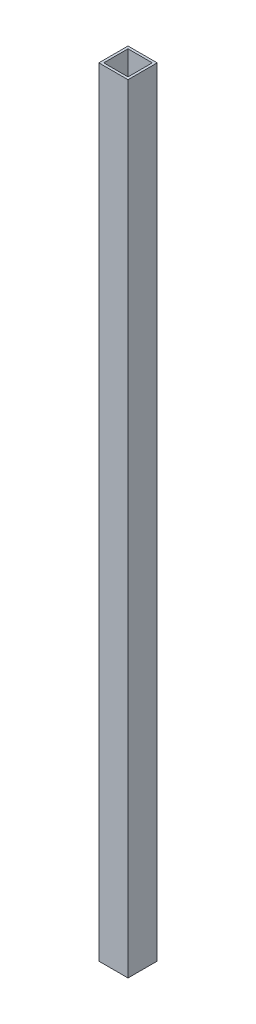
ISO-10303-21;
HEADER;
FILE_DESCRIPTION(('STEP AP214'),'2;1');
FILE_NAME('part.step','',(''),(''),'','','');
FILE_SCHEMA(('AUTOMOTIVE_DESIGN { 1 0 10303 214 1 1 1 1 }'));
ENDSEC;
DATA;
#1=APPLICATION_CONTEXT('core data for automotive mechanical design processes');
#2=APPLICATION_PROTOCOL_DEFINITION('international standard','automotive_design',2000,#1);
#3=PRODUCT_CONTEXT('',#1,'mechanical');
#4=PRODUCT('Part','Part','',(#3));
#5=PRODUCT_RELATED_PRODUCT_CATEGORY('part','',(#4));
#6=PRODUCT_DEFINITION_FORMATION('','',#4);
#7=PRODUCT_DEFINITION_CONTEXT('part definition',#1,'design');
#8=PRODUCT_DEFINITION('design','',#6,#7);
#9=PRODUCT_DEFINITION_SHAPE('','',#8);
#10=(LENGTH_UNIT() NAMED_UNIT(*) SI_UNIT(.MILLI.,.METRE.));
#11=(NAMED_UNIT(*) PLANE_ANGLE_UNIT() SI_UNIT($,.RADIAN.));
#12=(NAMED_UNIT(*) SI_UNIT($,.STERADIAN.) SOLID_ANGLE_UNIT());
#13=UNCERTAINTY_MEASURE_WITH_UNIT(LENGTH_MEASURE(1.E-05),#10,'distance_accuracy_value','');
#14=(GEOMETRIC_REPRESENTATION_CONTEXT(3) GLOBAL_UNCERTAINTY_ASSIGNED_CONTEXT((#13)) GLOBAL_UNIT_ASSIGNED_CONTEXT((#10,
#11,#12)) REPRESENTATION_CONTEXT('',''));
#15=CARTESIAN_POINT('',(0.,0.,0.));
#16=DIRECTION('',(0.,0.,1.));
#17=DIRECTION('',(1.,0.,0.));
#18=AXIS2_PLACEMENT_3D('',#15,#16,#17);
#19=CARTESIAN_POINT('',(0.,508.,0.));
#20=DIRECTION('',(0.,1.,0.));
#21=DIRECTION('',(0.,0.,1.));
#22=AXIS2_PLACEMENT_3D('',#19,#20,#21);
#23=PLANE('',#22);
#24=DIRECTION('',(0.,0.,1.));
#25=VECTOR('',#24,1.);
#26=CARTESIAN_POINT('',(0.,508.,0.));
#27=LINE('',#26,#25);
#28=CARTESIAN_POINT('',(0.,508.,-19.05));
#29=VERTEX_POINT('',#28);
#30=CARTESIAN_POINT('',(0.,508.,0.));
#31=VERTEX_POINT('',#30);
#32=EDGE_CURVE('E158',#29,#31,#27,.T.);
#33=ORIENTED_EDGE('',*,*,#32,.T.);
#34=DIRECTION('',(1.,0.,0.));
#35=VECTOR('',#34,1.);
#36=CARTESIAN_POINT('',(0.,508.,0.));
#37=LINE('',#36,#35);
#38=CARTESIAN_POINT('',(19.05,508.,0.));
#39=VERTEX_POINT('',#38);
#40=EDGE_CURVE('E161',#31,#39,#37,.T.);
#41=ORIENTED_EDGE('',*,*,#40,.T.);
#42=DIRECTION('',(0.,0.,-1.));
#43=VECTOR('',#42,1.);
#44=CARTESIAN_POINT('',(19.05,508.,0.));
#45=LINE('',#44,#43);
#46=CARTESIAN_POINT('',(19.05,508.,-19.05));
#47=VERTEX_POINT('',#46);
#48=EDGE_CURVE('E164',#39,#47,#45,.T.);
#49=ORIENTED_EDGE('',*,*,#48,.T.);
#50=DIRECTION('',(-1.,0.,0.));
#51=VECTOR('',#50,1.);
#52=CARTESIAN_POINT('',(0.,508.,-19.05));
#53=LINE('',#52,#51);
#54=EDGE_CURVE('E166',#47,#29,#53,.T.);
#55=ORIENTED_EDGE('',*,*,#54,.T.);
#56=EDGE_LOOP('',(#33,#41,#49,#55));
#57=FACE_BOUND('',#56,.T.);
#58=DIRECTION('',(1.,0.,0.));
#59=VECTOR('',#58,1.);
#60=CARTESIAN_POINT('',(0.,508.,-1.5875));
#61=LINE('',#60,#59);
#62=CARTESIAN_POINT('',(1.5875,508.,-1.5875));
#63=VERTEX_POINT('',#62);
#64=CARTESIAN_POINT('',(17.4625,508.,-1.5875));
#65=VERTEX_POINT('',#64);
#66=EDGE_CURVE('E130',#63,#65,#61,.T.);
#67=ORIENTED_EDGE('',*,*,#66,.F.);
#68=DIRECTION('',(0.,0.,1.));
#69=VECTOR('',#68,1.);
#70=CARTESIAN_POINT('',(1.5875,508.,0.));
#71=LINE('',#70,#69);
#72=CARTESIAN_POINT('',(1.5875,508.,-17.4625));
#73=VERTEX_POINT('',#72);
#74=EDGE_CURVE('E122',#73,#63,#71,.T.);
#75=ORIENTED_EDGE('',*,*,#74,.F.);
#76=DIRECTION('',(-1.,0.,0.));
#77=VECTOR('',#76,1.);
#78=CARTESIAN_POINT('',(0.,508.,-17.4625));
#79=LINE('',#78,#77);
#80=CARTESIAN_POINT('',(17.4625,508.,-17.4625));
#81=VERTEX_POINT('',#80);
#82=EDGE_CURVE('E144',#81,#73,#79,.T.);
#83=ORIENTED_EDGE('',*,*,#82,.F.);
#84=DIRECTION('',(0.,0.,-1.));
#85=VECTOR('',#84,1.);
#86=CARTESIAN_POINT('',(17.4625,508.,0.));
#87=LINE('',#86,#85);
#88=EDGE_CURVE('E142',#65,#81,#87,.T.);
#89=ORIENTED_EDGE('',*,*,#88,.F.);
#90=EDGE_LOOP('',(#67,#75,#83,#89));
#91=FACE_BOUND('',#90,.T.);
#92=ADVANCED_FACE('F57',(#57,#91),#23,.T.);
#93=CARTESIAN_POINT('',(0.,0.,0.));
#94=DIRECTION('',(0.,1.,0.));
#95=DIRECTION('',(0.,0.,1.));
#96=AXIS2_PLACEMENT_3D('',#93,#94,#95);
#97=PLANE('',#96);
#98=DIRECTION('',(0.,0.,1.));
#99=VECTOR('',#98,1.);
#100=CARTESIAN_POINT('',(0.,0.,0.));
#101=LINE('',#100,#99);
#102=CARTESIAN_POINT('',(0.,0.,-19.05));
#103=VERTEX_POINT('',#102);
#104=CARTESIAN_POINT('',(0.,0.,0.));
#105=VERTEX_POINT('',#104);
#106=EDGE_CURVE('E138',#103,#105,#101,.T.);
#107=ORIENTED_EDGE('',*,*,#106,.F.);
#108=DIRECTION('',(-1.,0.,0.));
#109=VECTOR('',#108,1.);
#110=CARTESIAN_POINT('',(0.,0.,-19.05));
#111=LINE('',#110,#109);
#112=CARTESIAN_POINT('',(19.05,0.,-19.05));
#113=VERTEX_POINT('',#112);
#114=EDGE_CURVE('E162',#113,#103,#111,.T.);
#115=ORIENTED_EDGE('',*,*,#114,.F.);
#116=DIRECTION('',(0.,0.,-1.));
#117=VECTOR('',#116,1.);
#118=CARTESIAN_POINT('',(19.05,0.,0.));
#119=LINE('',#118,#117);
#120=CARTESIAN_POINT('',(19.05,0.,0.));
#121=VERTEX_POINT('',#120);
#122=EDGE_CURVE('E173',#121,#113,#119,.T.);
#123=ORIENTED_EDGE('',*,*,#122,.F.);
#124=DIRECTION('',(1.,0.,0.));
#125=VECTOR('',#124,1.);
#126=CARTESIAN_POINT('',(0.,0.,0.));
#127=LINE('',#126,#125);
#128=EDGE_CURVE('E171',#105,#121,#127,.T.);
#129=ORIENTED_EDGE('',*,*,#128,.F.);
#130=EDGE_LOOP('',(#107,#115,#123,#129));
#131=FACE_BOUND('',#130,.T.);
#132=DIRECTION('',(0.,0.,1.));
#133=VECTOR('',#132,1.);
#134=CARTESIAN_POINT('',(1.5875,0.,0.));
#135=LINE('',#134,#133);
#136=CARTESIAN_POINT('',(1.5875,0.,-17.4625));
#137=VERTEX_POINT('',#136);
#138=CARTESIAN_POINT('',(1.5875,0.,-1.5875));
#139=VERTEX_POINT('',#138);
#140=EDGE_CURVE('E80',#137,#139,#135,.T.);
#141=ORIENTED_EDGE('',*,*,#140,.T.);
#142=DIRECTION('',(1.,0.,0.));
#143=VECTOR('',#142,1.);
#144=CARTESIAN_POINT('',(0.,0.,-1.5875));
#145=LINE('',#144,#143);
#146=CARTESIAN_POINT('',(17.4625,0.,-1.5875));
#147=VERTEX_POINT('',#146);
#148=EDGE_CURVE('E137',#139,#147,#145,.T.);
#149=ORIENTED_EDGE('',*,*,#148,.T.);
#150=DIRECTION('',(0.,0.,-1.));
#151=VECTOR('',#150,1.);
#152=CARTESIAN_POINT('',(17.4625,0.,0.));
#153=LINE('',#152,#151);
#154=CARTESIAN_POINT('',(17.4625,0.,-17.4625));
#155=VERTEX_POINT('',#154);
#156=EDGE_CURVE('E150',#147,#155,#153,.T.);
#157=ORIENTED_EDGE('',*,*,#156,.T.);
#158=DIRECTION('',(-1.,0.,0.));
#159=VECTOR('',#158,1.);
#160=CARTESIAN_POINT('',(0.,0.,-17.4625));
#161=LINE('',#160,#159);
#162=EDGE_CURVE('E131',#155,#137,#161,.T.);
#163=ORIENTED_EDGE('',*,*,#162,.T.);
#164=EDGE_LOOP('',(#141,#149,#157,#163));
#165=FACE_BOUND('',#164,.T.);
#166=ADVANCED_FACE('F191',(#131,#165),#97,.F.);
#167=CARTESIAN_POINT('',(0.,508.,0.));
#168=DIRECTION('',(1.,0.,0.));
#169=DIRECTION('',(0.,0.,-1.));
#170=AXIS2_PLACEMENT_3D('',#167,#168,#169);
#171=PLANE('',#170);
#172=ORIENTED_EDGE('',*,*,#106,.T.);
#173=DIRECTION('',(0.,-1.,0.));
#174=VECTOR('',#173,1.);
#175=CARTESIAN_POINT('',(0.,508.,0.));
#176=LINE('',#175,#174);
#177=EDGE_CURVE('E12',#31,#105,#176,.T.);
#178=ORIENTED_EDGE('',*,*,#177,.F.);
#179=ORIENTED_EDGE('',*,*,#32,.F.);
#180=DIRECTION('',(0.,-1.,0.));
#181=VECTOR('',#180,1.);
#182=CARTESIAN_POINT('',(0.,508.,-19.05));
#183=LINE('',#182,#181);
#184=EDGE_CURVE('E168',#29,#103,#183,.T.);
#185=ORIENTED_EDGE('',*,*,#184,.T.);
#186=EDGE_LOOP('',(#172,#178,#179,#185));
#187=FACE_BOUND('',#186,.T.);
#188=ADVANCED_FACE('F59',(#187),#171,.F.);
#189=CARTESIAN_POINT('',(0.,508.,0.));
#190=DIRECTION('',(0.,0.,-1.));
#191=DIRECTION('',(-1.,0.,0.));
#192=AXIS2_PLACEMENT_3D('',#189,#190,#191);
#193=PLANE('',#192);
#194=ORIENTED_EDGE('',*,*,#128,.T.);
#195=DIRECTION('',(0.,-1.,0.));
#196=VECTOR('',#195,1.);
#197=CARTESIAN_POINT('',(19.05,508.,0.));
#198=LINE('',#197,#196);
#199=EDGE_CURVE('E65',#39,#121,#198,.T.);
#200=ORIENTED_EDGE('',*,*,#199,.F.);
#201=ORIENTED_EDGE('',*,*,#40,.F.);
#202=ORIENTED_EDGE('',*,*,#177,.T.);
#203=EDGE_LOOP('',(#194,#200,#201,#202));
#204=FACE_BOUND('',#203,.T.);
#205=ADVANCED_FACE('F201',(#204),#193,.F.);
#206=CARTESIAN_POINT('',(19.05,508.,0.));
#207=DIRECTION('',(-1.,0.,0.));
#208=DIRECTION('',(0.,0.,1.));
#209=AXIS2_PLACEMENT_3D('',#206,#207,#208);
#210=PLANE('',#209);
#211=ORIENTED_EDGE('',*,*,#122,.T.);
#212=DIRECTION('',(0.,-1.,0.));
#213=VECTOR('',#212,1.);
#214=CARTESIAN_POINT('',(19.05,508.,-19.05));
#215=LINE('',#214,#213);
#216=EDGE_CURVE('E178',#47,#113,#215,.T.);
#217=ORIENTED_EDGE('',*,*,#216,.F.);
#218=ORIENTED_EDGE('',*,*,#48,.F.);
#219=ORIENTED_EDGE('',*,*,#199,.T.);
#220=EDGE_LOOP('',(#211,#217,#218,#219));
#221=FACE_BOUND('',#220,.T.);
#222=ADVANCED_FACE('F185',(#221),#210,.F.);
#223=CARTESIAN_POINT('',(0.,508.,-19.05));
#224=DIRECTION('',(0.,0.,1.));
#225=DIRECTION('',(1.,0.,0.));
#226=AXIS2_PLACEMENT_3D('',#223,#224,#225);
#227=PLANE('',#226);
#228=ORIENTED_EDGE('',*,*,#114,.T.);
#229=ORIENTED_EDGE('',*,*,#184,.F.);
#230=ORIENTED_EDGE('',*,*,#54,.F.);
#231=ORIENTED_EDGE('',*,*,#216,.T.);
#232=EDGE_LOOP('',(#228,#229,#230,#231));
#233=FACE_BOUND('',#232,.T.);
#234=ADVANCED_FACE('F195',(#233),#227,.F.);
#235=CARTESIAN_POINT('',(1.5875,508.,0.));
#236=DIRECTION('',(1.,0.,0.));
#237=DIRECTION('',(0.,0.,-1.));
#238=AXIS2_PLACEMENT_3D('',#235,#236,#237);
#239=PLANE('',#238);
#240=ORIENTED_EDGE('',*,*,#140,.F.);
#241=DIRECTION('',(0.,-1.,0.));
#242=VECTOR('',#241,1.);
#243=CARTESIAN_POINT('',(1.5875,508.,-17.4625));
#244=LINE('',#243,#242);
#245=EDGE_CURVE('E126',#73,#137,#244,.T.);
#246=ORIENTED_EDGE('',*,*,#245,.F.);
#247=ORIENTED_EDGE('',*,*,#74,.T.);
#248=DIRECTION('',(0.,-1.,0.));
#249=VECTOR('',#248,1.);
#250=CARTESIAN_POINT('',(1.5875,508.,-1.5875));
#251=LINE('',#250,#249);
#252=EDGE_CURVE('E125',#63,#139,#251,.T.);
#253=ORIENTED_EDGE('',*,*,#252,.T.);
#254=EDGE_LOOP('',(#240,#246,#247,#253));
#255=FACE_BOUND('',#254,.T.);
#256=ADVANCED_FACE('F124',(#255),#239,.T.);
#257=CARTESIAN_POINT('',(0.,508.,-1.5875));
#258=DIRECTION('',(0.,0.,-1.));
#259=DIRECTION('',(-1.,0.,0.));
#260=AXIS2_PLACEMENT_3D('',#257,#258,#259);
#261=PLANE('',#260);
#262=ORIENTED_EDGE('',*,*,#148,.F.);
#263=ORIENTED_EDGE('',*,*,#252,.F.);
#264=ORIENTED_EDGE('',*,*,#66,.T.);
#265=DIRECTION('',(0.,-1.,0.));
#266=VECTOR('',#265,1.);
#267=CARTESIAN_POINT('',(17.4625,508.,-1.5875));
#268=LINE('',#267,#266);
#269=EDGE_CURVE('E139',#65,#147,#268,.T.);
#270=ORIENTED_EDGE('',*,*,#269,.T.);
#271=EDGE_LOOP('',(#262,#263,#264,#270));
#272=FACE_BOUND('',#271,.T.);
#273=ADVANCED_FACE('F134',(#272),#261,.T.);
#274=CARTESIAN_POINT('',(17.4625,508.,0.));
#275=DIRECTION('',(-1.,0.,0.));
#276=DIRECTION('',(0.,0.,1.));
#277=AXIS2_PLACEMENT_3D('',#274,#275,#276);
#278=PLANE('',#277);
#279=ORIENTED_EDGE('',*,*,#156,.F.);
#280=ORIENTED_EDGE('',*,*,#269,.F.);
#281=ORIENTED_EDGE('',*,*,#88,.T.);
#282=DIRECTION('',(0.,-1.,0.));
#283=VECTOR('',#282,1.);
#284=CARTESIAN_POINT('',(17.4625,508.,-17.4625));
#285=LINE('',#284,#283);
#286=EDGE_CURVE('E72',#81,#155,#285,.T.);
#287=ORIENTED_EDGE('',*,*,#286,.T.);
#288=EDGE_LOOP('',(#279,#280,#281,#287));
#289=FACE_BOUND('',#288,.T.);
#290=ADVANCED_FACE('F224',(#289),#278,.T.);
#291=CARTESIAN_POINT('',(0.,508.,-17.4625));
#292=DIRECTION('',(0.,0.,1.));
#293=DIRECTION('',(1.,0.,0.));
#294=AXIS2_PLACEMENT_3D('',#291,#292,#293);
#295=PLANE('',#294);
#296=ORIENTED_EDGE('',*,*,#162,.F.);
#297=ORIENTED_EDGE('',*,*,#286,.F.);
#298=ORIENTED_EDGE('',*,*,#82,.T.);
#299=ORIENTED_EDGE('',*,*,#245,.T.);
#300=EDGE_LOOP('',(#296,#297,#298,#299));
#301=FACE_BOUND('',#300,.T.);
#302=ADVANCED_FACE('F228',(#301),#295,.T.);
#303=CLOSED_SHELL('',(#92,#166,#188,#205,#222,#234,#256,#273,#290,#302));
#304=MANIFOLD_SOLID_BREP('B2',#303);
#305=ADVANCED_BREP_SHAPE_REPRESENTATION('',(#18,#304),#14);
#306=SHAPE_DEFINITION_REPRESENTATION(#9,#305);
ENDSEC;
END-ISO-10303-21;
